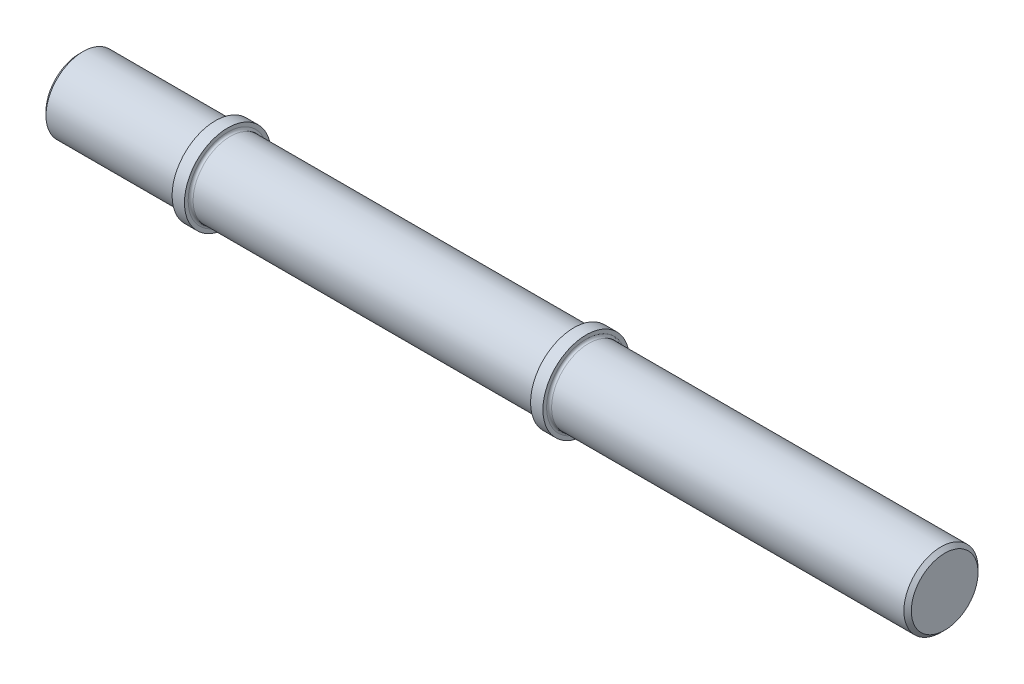
ISO-10303-21;
HEADER;
FILE_DESCRIPTION(('STEP AP214'),'2;1');
FILE_NAME('part.step','',(''),(''),'','','');
FILE_SCHEMA(('AUTOMOTIVE_DESIGN { 1 0 10303 214 1 1 1 1 }'));
ENDSEC;
DATA;
#1=APPLICATION_CONTEXT('core data for automotive mechanical design processes');
#2=APPLICATION_PROTOCOL_DEFINITION('international standard','automotive_design',2000,#1);
#3=PRODUCT_CONTEXT('',#1,'mechanical');
#4=PRODUCT('Part','Part','',(#3));
#5=PRODUCT_RELATED_PRODUCT_CATEGORY('part','',(#4));
#6=PRODUCT_DEFINITION_FORMATION('','',#4);
#7=PRODUCT_DEFINITION_CONTEXT('part definition',#1,'design');
#8=PRODUCT_DEFINITION('design','',#6,#7);
#9=PRODUCT_DEFINITION_SHAPE('','',#8);
#10=(LENGTH_UNIT() NAMED_UNIT(*) SI_UNIT(.MILLI.,.METRE.));
#11=(NAMED_UNIT(*) PLANE_ANGLE_UNIT() SI_UNIT($,.RADIAN.));
#12=(NAMED_UNIT(*) SI_UNIT($,.STERADIAN.) SOLID_ANGLE_UNIT());
#13=UNCERTAINTY_MEASURE_WITH_UNIT(LENGTH_MEASURE(1.E-05),#10,'distance_accuracy_value','');
#14=(GEOMETRIC_REPRESENTATION_CONTEXT(3) GLOBAL_UNCERTAINTY_ASSIGNED_CONTEXT((#13)) GLOBAL_UNIT_ASSIGNED_CONTEXT((#10,
#11,#12)) REPRESENTATION_CONTEXT('',''));
#15=CARTESIAN_POINT('',(0.,0.,0.));
#16=DIRECTION('',(0.,0.,1.));
#17=DIRECTION('',(1.,0.,0.));
#18=AXIS2_PLACEMENT_3D('',#15,#16,#17);
#19=CARTESIAN_POINT('',(70.,0.,0.));
#20=DIRECTION('',(-1.,0.,0.));
#21=DIRECTION('',(0.,0.,1.));
#22=AXIS2_PLACEMENT_3D('',#19,#20,#21);
#23=PLANE('',#22);
#24=CARTESIAN_POINT('',(70.,0.,0.));
#25=DIRECTION('',(-1.,0.,0.));
#26=DIRECTION('',(0.,0.,1.));
#27=AXIS2_PLACEMENT_3D('',#24,#25,#26);
#28=CIRCLE('',#27,2.70000000000001);
#29=CARTESIAN_POINT('',(70.,0.,2.70000000000001));
#30=VERTEX_POINT('',#29);
#31=EDGE_CURVE('E47',#30,#30,#28,.F.);
#32=ORIENTED_EDGE('',*,*,#31,.T.);
#33=EDGE_LOOP('',(#32));
#34=FACE_BOUND('',#33,.T.);
#35=ADVANCED_FACE('F35',(#34),#23,.F.);
#36=CARTESIAN_POINT('',(0.,0.,0.));
#37=DIRECTION('',(-1.,0.,0.));
#38=DIRECTION('',(0.,0.,1.));
#39=AXIS2_PLACEMENT_3D('',#36,#37,#38);
#40=CYLINDRICAL_SURFACE('',#39,3.);
#41=CARTESIAN_POINT('',(69.7,0.,0.));
#42=DIRECTION('',(-1.,0.,0.));
#43=DIRECTION('',(0.,0.,1.));
#44=AXIS2_PLACEMENT_3D('',#41,#42,#43);
#45=CIRCLE('',#44,3.);
#46=CARTESIAN_POINT('',(69.7,0.,3.));
#47=VERTEX_POINT('',#46);
#48=EDGE_CURVE('E51',#47,#47,#45,.T.);
#49=ORIENTED_EDGE('',*,*,#48,.T.);
#50=EDGE_LOOP('',(#49));
#51=FACE_BOUND('',#50,.T.);
#52=CARTESIAN_POINT('',(41.2,0.,0.));
#53=DIRECTION('',(1.,0.,0.));
#54=DIRECTION('',(0.,0.,-1.));
#55=AXIS2_PLACEMENT_3D('',#52,#53,#54);
#56=CIRCLE('',#55,3.);
#57=CARTESIAN_POINT('',(41.2,0.,-3.));
#58=VERTEX_POINT('',#57);
#59=EDGE_CURVE('E59',#58,#58,#56,.T.);
#60=ORIENTED_EDGE('',*,*,#59,.T.);
#61=EDGE_LOOP('',(#60));
#62=FACE_BOUND('',#61,.T.);
#63=ADVANCED_FACE('F113',(#51,#62),#40,.T.);
#64=CARTESIAN_POINT('',(41.,0.,0.));
#65=DIRECTION('',(1.,0.,0.));
#66=DIRECTION('',(0.,0.,-1.));
#67=AXIS2_PLACEMENT_3D('',#64,#65,#66);
#68=PLANE('',#67);
#69=CARTESIAN_POINT('',(41.,0.,0.));
#70=DIRECTION('',(1.,0.,0.));
#71=DIRECTION('',(0.,0.,-1.));
#72=AXIS2_PLACEMENT_3D('',#69,#70,#71);
#73=CIRCLE('',#72,3.2);
#74=CARTESIAN_POINT('',(41.,0.,-3.2));
#75=VERTEX_POINT('',#74);
#76=EDGE_CURVE('E62',#75,#75,#73,.F.);
#77=ORIENTED_EDGE('',*,*,#76,.T.);
#78=EDGE_LOOP('',(#77));
#79=FACE_BOUND('',#78,.T.);
#80=CARTESIAN_POINT('',(41.,0.,0.));
#81=DIRECTION('',(-1.,0.,0.));
#82=DIRECTION('',(0.,0.,1.));
#83=AXIS2_PLACEMENT_3D('',#80,#81,#82);
#84=CIRCLE('',#83,3.5);
#85=CARTESIAN_POINT('',(41.,0.,3.5));
#86=VERTEX_POINT('',#85);
#87=EDGE_CURVE('E80',#86,#86,#84,.T.);
#88=ORIENTED_EDGE('',*,*,#87,.F.);
#89=EDGE_LOOP('',(#88));
#90=FACE_BOUND('',#89,.T.);
#91=ADVANCED_FACE('F119',(#79,#90),#68,.T.);
#92=CARTESIAN_POINT('',(0.,0.,0.));
#93=DIRECTION('',(-1.,0.,0.));
#94=DIRECTION('',(0.,0.,1.));
#95=AXIS2_PLACEMENT_3D('',#92,#93,#94);
#96=CYLINDRICAL_SURFACE('',#95,3.5);
#97=ORIENTED_EDGE('',*,*,#87,.T.);
#98=EDGE_LOOP('',(#97));
#99=FACE_BOUND('',#98,.T.);
#100=CARTESIAN_POINT('',(40.,0.,0.));
#101=DIRECTION('',(-1.,0.,0.));
#102=DIRECTION('',(0.,0.,1.));
#103=AXIS2_PLACEMENT_3D('',#100,#101,#102);
#104=CIRCLE('',#103,3.5);
#105=CARTESIAN_POINT('',(40.,0.,3.5));
#106=VERTEX_POINT('',#105);
#107=EDGE_CURVE('E83',#106,#106,#104,.T.);
#108=ORIENTED_EDGE('',*,*,#107,.F.);
#109=EDGE_LOOP('',(#108));
#110=FACE_BOUND('',#109,.T.);
#111=ADVANCED_FACE('F160',(#99,#110),#96,.T.);
#112=CARTESIAN_POINT('',(40.,0.,0.));
#113=DIRECTION('',(-1.,0.,0.));
#114=DIRECTION('',(0.,0.,1.));
#115=AXIS2_PLACEMENT_3D('',#112,#113,#114);
#116=PLANE('',#115);
#117=CARTESIAN_POINT('',(40.,0.,0.));
#118=DIRECTION('',(-1.,0.,0.));
#119=DIRECTION('',(0.,0.,1.));
#120=AXIS2_PLACEMENT_3D('',#117,#118,#119);
#121=CIRCLE('',#120,3.2);
#122=CARTESIAN_POINT('',(40.,0.,3.2));
#123=VERTEX_POINT('',#122);
#124=EDGE_CURVE('E56',#123,#123,#121,.F.);
#125=ORIENTED_EDGE('',*,*,#124,.T.);
#126=EDGE_LOOP('',(#125));
#127=FACE_BOUND('',#126,.T.);
#128=ORIENTED_EDGE('',*,*,#107,.T.);
#129=EDGE_LOOP('',(#128));
#130=FACE_BOUND('',#129,.T.);
#131=ADVANCED_FACE('F109',(#127,#130),#116,.T.);
#132=CARTESIAN_POINT('',(0.,0.,0.));
#133=DIRECTION('',(-1.,0.,0.));
#134=DIRECTION('',(0.,0.,1.));
#135=AXIS2_PLACEMENT_3D('',#132,#133,#134);
#136=CYLINDRICAL_SURFACE('',#135,3.);
#137=CARTESIAN_POINT('',(12.2,0.,0.));
#138=DIRECTION('',(-1.,0.,0.));
#139=DIRECTION('',(0.,0.,1.));
#140=AXIS2_PLACEMENT_3D('',#137,#138,#139);
#141=CIRCLE('',#140,3.);
#142=CARTESIAN_POINT('',(12.2,0.,3.));
#143=VERTEX_POINT('',#142);
#144=EDGE_CURVE('E65',#143,#143,#141,.F.);
#145=ORIENTED_EDGE('',*,*,#144,.T.);
#146=EDGE_LOOP('',(#145));
#147=FACE_BOUND('',#146,.T.);
#148=CARTESIAN_POINT('',(39.8,0.,0.));
#149=DIRECTION('',(-1.,0.,0.));
#150=DIRECTION('',(0.,0.,1.));
#151=AXIS2_PLACEMENT_3D('',#148,#149,#150);
#152=CIRCLE('',#151,3.);
#153=CARTESIAN_POINT('',(39.8,0.,3.));
#154=VERTEX_POINT('',#153);
#155=EDGE_CURVE('E68',#154,#154,#152,.T.);
#156=ORIENTED_EDGE('',*,*,#155,.T.);
#157=EDGE_LOOP('',(#156));
#158=FACE_BOUND('',#157,.T.);
#159=ADVANCED_FACE('F103',(#147,#158),#136,.T.);
#160=CARTESIAN_POINT('',(12.,0.,0.));
#161=DIRECTION('',(-1.,0.,0.));
#162=DIRECTION('',(0.,0.,1.));
#163=AXIS2_PLACEMENT_3D('',#160,#161,#162);
#164=PLANE('',#163);
#165=CARTESIAN_POINT('',(12.,0.,0.));
#166=DIRECTION('',(-1.,0.,0.));
#167=DIRECTION('',(0.,0.,1.));
#168=AXIS2_PLACEMENT_3D('',#165,#166,#167);
#169=CIRCLE('',#168,3.2);
#170=CARTESIAN_POINT('',(12.,0.,3.2));
#171=VERTEX_POINT('',#170);
#172=EDGE_CURVE('E71',#171,#171,#169,.T.);
#173=ORIENTED_EDGE('',*,*,#172,.T.);
#174=EDGE_LOOP('',(#173));
#175=FACE_BOUND('',#174,.T.);
#176=CARTESIAN_POINT('',(12.,0.,0.));
#177=DIRECTION('',(-1.,0.,0.));
#178=DIRECTION('',(0.,0.,1.));
#179=AXIS2_PLACEMENT_3D('',#176,#177,#178);
#180=CIRCLE('',#179,3.5);
#181=CARTESIAN_POINT('',(12.,0.,3.5));
#182=VERTEX_POINT('',#181);
#183=EDGE_CURVE('E86',#182,#182,#180,.T.);
#184=ORIENTED_EDGE('',*,*,#183,.F.);
#185=EDGE_LOOP('',(#184));
#186=FACE_BOUND('',#185,.T.);
#187=ADVANCED_FACE('F98',(#175,#186),#164,.F.);
#188=CARTESIAN_POINT('',(0.,0.,0.));
#189=DIRECTION('',(-1.,0.,0.));
#190=DIRECTION('',(0.,0.,1.));
#191=AXIS2_PLACEMENT_3D('',#188,#189,#190);
#192=CYLINDRICAL_SURFACE('',#191,3.5);
#193=CARTESIAN_POINT('',(11.,0.,0.));
#194=DIRECTION('',(-1.,0.,0.));
#195=DIRECTION('',(0.,0.,1.));
#196=AXIS2_PLACEMENT_3D('',#193,#194,#195);
#197=CIRCLE('',#196,3.5);
#198=CARTESIAN_POINT('',(11.,0.,3.5));
#199=VERTEX_POINT('',#198);
#200=EDGE_CURVE('E89',#199,#199,#197,.T.);
#201=ORIENTED_EDGE('',*,*,#200,.F.);
#202=EDGE_LOOP('',(#201));
#203=FACE_BOUND('',#202,.T.);
#204=ORIENTED_EDGE('',*,*,#183,.T.);
#205=EDGE_LOOP('',(#204));
#206=FACE_BOUND('',#205,.T.);
#207=ADVANCED_FACE('F95',(#203,#206),#192,.T.);
#208=CARTESIAN_POINT('',(11.,0.,0.));
#209=DIRECTION('',(1.,0.,0.));
#210=DIRECTION('',(0.,0.,-1.));
#211=AXIS2_PLACEMENT_3D('',#208,#209,#210);
#212=PLANE('',#211);
#213=CARTESIAN_POINT('',(11.,0.,0.));
#214=DIRECTION('',(1.,0.,0.));
#215=DIRECTION('',(0.,0.,-1.));
#216=AXIS2_PLACEMENT_3D('',#213,#214,#215);
#217=CIRCLE('',#216,3.2);
#218=CARTESIAN_POINT('',(11.,0.,-3.2));
#219=VERTEX_POINT('',#218);
#220=EDGE_CURVE('E74',#219,#219,#217,.T.);
#221=ORIENTED_EDGE('',*,*,#220,.T.);
#222=EDGE_LOOP('',(#221));
#223=FACE_BOUND('',#222,.T.);
#224=ORIENTED_EDGE('',*,*,#200,.T.);
#225=EDGE_LOOP('',(#224));
#226=FACE_BOUND('',#225,.T.);
#227=ADVANCED_FACE('F93',(#223,#226),#212,.F.);
#228=CARTESIAN_POINT('',(0.,0.,0.));
#229=DIRECTION('',(-1.,0.,0.));
#230=DIRECTION('',(0.,0.,1.));
#231=AXIS2_PLACEMENT_3D('',#228,#229,#230);
#232=CYLINDRICAL_SURFACE('',#231,3.);
#233=CARTESIAN_POINT('',(0.300000000000012,0.,0.));
#234=DIRECTION('',(-1.,0.,0.));
#235=DIRECTION('',(0.,0.,1.));
#236=AXIS2_PLACEMENT_3D('',#233,#234,#235);
#237=CIRCLE('',#236,3.);
#238=CARTESIAN_POINT('',(0.300000000000012,0.,3.));
#239=VERTEX_POINT('',#238);
#240=EDGE_CURVE('E10',#239,#239,#237,.F.);
#241=ORIENTED_EDGE('',*,*,#240,.T.);
#242=EDGE_LOOP('',(#241));
#243=FACE_BOUND('',#242,.T.);
#244=CARTESIAN_POINT('',(10.8,0.,0.));
#245=DIRECTION('',(1.,0.,0.));
#246=DIRECTION('',(0.,0.,-1.));
#247=AXIS2_PLACEMENT_3D('',#244,#245,#246);
#248=CIRCLE('',#247,3.);
#249=CARTESIAN_POINT('',(10.8,0.,-3.));
#250=VERTEX_POINT('',#249);
#251=EDGE_CURVE('E77',#250,#250,#248,.F.);
#252=ORIENTED_EDGE('',*,*,#251,.T.);
#253=EDGE_LOOP('',(#252));
#254=FACE_BOUND('',#253,.T.);
#255=ADVANCED_FACE('F198',(#243,#254),#232,.T.);
#256=CARTESIAN_POINT('',(0.,0.,0.));
#257=DIRECTION('',(-1.,0.,0.));
#258=DIRECTION('',(0.,0.,1.));
#259=AXIS2_PLACEMENT_3D('',#256,#257,#258);
#260=PLANE('',#259);
#261=CARTESIAN_POINT('',(0.,0.,0.));
#262=DIRECTION('',(-1.,0.,0.));
#263=DIRECTION('',(0.,0.,1.));
#264=AXIS2_PLACEMENT_3D('',#261,#262,#263);
#265=CIRCLE('',#264,2.69999999999999);
#266=CARTESIAN_POINT('',(0.,0.,2.69999999999999));
#267=VERTEX_POINT('',#266);
#268=EDGE_CURVE('E43',#267,#267,#265,.T.);
#269=ORIENTED_EDGE('',*,*,#268,.T.);
#270=EDGE_LOOP('',(#269));
#271=FACE_BOUND('',#270,.T.);
#272=ADVANCED_FACE('F128',(#271),#260,.T.);
#273=CARTESIAN_POINT('',(10.8,0.,0.));
#274=DIRECTION('',(1.,0.,0.));
#275=DIRECTION('',(0.,0.,-1.));
#276=AXIS2_PLACEMENT_3D('',#273,#274,#275);
#277=TOROIDAL_SURFACE('',#276,3.2,0.2);
#278=ORIENTED_EDGE('',*,*,#220,.F.);
#279=EDGE_LOOP('',(#278));
#280=FACE_BOUND('',#279,.T.);
#281=ORIENTED_EDGE('',*,*,#251,.F.);
#282=EDGE_LOOP('',(#281));
#283=FACE_BOUND('',#282,.T.);
#284=ADVANCED_FACE('F124',(#280,#283),#277,.F.);
#285=CARTESIAN_POINT('',(12.2,0.,0.));
#286=DIRECTION('',(-1.,0.,0.));
#287=DIRECTION('',(0.,0.,1.));
#288=AXIS2_PLACEMENT_3D('',#285,#286,#287);
#289=TOROIDAL_SURFACE('',#288,3.2,0.2);
#290=ORIENTED_EDGE('',*,*,#144,.F.);
#291=EDGE_LOOP('',(#290));
#292=FACE_BOUND('',#291,.T.);
#293=ORIENTED_EDGE('',*,*,#172,.F.);
#294=EDGE_LOOP('',(#293));
#295=FACE_BOUND('',#294,.T.);
#296=ADVANCED_FACE('F127',(#292,#295),#289,.F.);
#297=CARTESIAN_POINT('',(41.2,0.,0.));
#298=DIRECTION('',(1.,0.,0.));
#299=DIRECTION('',(0.,0.,-1.));
#300=AXIS2_PLACEMENT_3D('',#297,#298,#299);
#301=TOROIDAL_SURFACE('',#300,3.2,0.2);
#302=ORIENTED_EDGE('',*,*,#59,.F.);
#303=EDGE_LOOP('',(#302));
#304=FACE_BOUND('',#303,.T.);
#305=ORIENTED_EDGE('',*,*,#76,.F.);
#306=EDGE_LOOP('',(#305));
#307=FACE_BOUND('',#306,.T.);
#308=ADVANCED_FACE('F132',(#304,#307),#301,.F.);
#309=CARTESIAN_POINT('',(39.8,0.,0.));
#310=DIRECTION('',(-1.,0.,0.));
#311=DIRECTION('',(0.,0.,1.));
#312=AXIS2_PLACEMENT_3D('',#309,#310,#311);
#313=TOROIDAL_SURFACE('',#312,3.2,0.2);
#314=ORIENTED_EDGE('',*,*,#124,.F.);
#315=EDGE_LOOP('',(#314));
#316=FACE_BOUND('',#315,.T.);
#317=ORIENTED_EDGE('',*,*,#155,.F.);
#318=EDGE_LOOP('',(#317));
#319=FACE_BOUND('',#318,.T.);
#320=ADVANCED_FACE('F136',(#316,#319),#313,.F.);
#321=CARTESIAN_POINT('',(69.7,0.,0.));
#322=DIRECTION('',(-1.,0.,0.));
#323=DIRECTION('',(0.,0.,1.));
#324=AXIS2_PLACEMENT_3D('',#321,#322,#323);
#325=CONICAL_SURFACE('',#324,3.,0.785398163397445);
#326=ORIENTED_EDGE('',*,*,#31,.F.);
#327=EDGE_LOOP('',(#326));
#328=FACE_BOUND('',#327,.T.);
#329=ORIENTED_EDGE('',*,*,#48,.F.);
#330=EDGE_LOOP('',(#329));
#331=FACE_BOUND('',#330,.T.);
#332=ADVANCED_FACE('F139',(#328,#331),#325,.T.);
#333=CARTESIAN_POINT('',(0.,0.,0.));
#334=DIRECTION('',(1.,0.,0.));
#335=DIRECTION('',(0.,0.,-1.));
#336=AXIS2_PLACEMENT_3D('',#333,#334,#335);
#337=CONICAL_SURFACE('',#336,2.69999999999999,0.785398163397437);
#338=ORIENTED_EDGE('',*,*,#240,.F.);
#339=EDGE_LOOP('',(#338));
#340=FACE_BOUND('',#339,.T.);
#341=ORIENTED_EDGE('',*,*,#268,.F.);
#342=EDGE_LOOP('',(#341));
#343=FACE_BOUND('',#342,.T.);
#344=ADVANCED_FACE('F38',(#340,#343),#337,.T.);
#345=CLOSED_SHELL('',(#35,#63,#91,#111,#131,#159,#187,#207,#227,#255,#272,#284,#296,#308,#320,
#332,#344));
#346=MANIFOLD_SOLID_BREP('B2',#345);
#347=ADVANCED_BREP_SHAPE_REPRESENTATION('',(#18,#346),#14);
#348=SHAPE_DEFINITION_REPRESENTATION(#9,#347);
ENDSEC;
END-ISO-10303-21;
